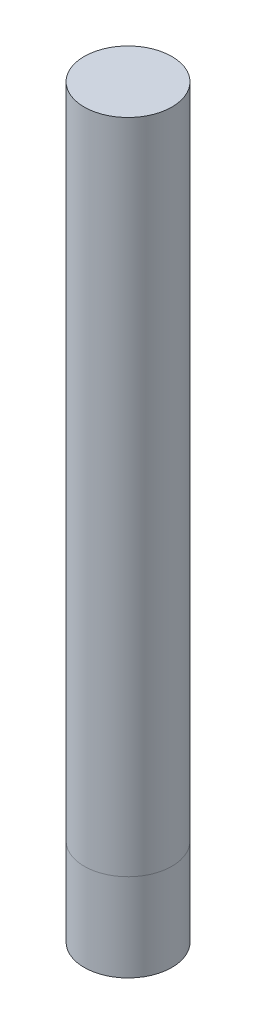
ISO-10303-21;
HEADER;
FILE_DESCRIPTION(('STEP AP214'),'2;1');
FILE_NAME('part.step','',(''),(''),'','','');
FILE_SCHEMA(('AUTOMOTIVE_DESIGN { 1 0 10303 214 1 1 1 1 }'));
ENDSEC;
DATA;
#1=APPLICATION_CONTEXT('core data for automotive mechanical design processes');
#2=APPLICATION_PROTOCOL_DEFINITION('international standard','automotive_design',2000,#1);
#3=PRODUCT_CONTEXT('',#1,'mechanical');
#4=PRODUCT('Part','Part','',(#3));
#5=PRODUCT_RELATED_PRODUCT_CATEGORY('part','',(#4));
#6=PRODUCT_DEFINITION_FORMATION('','',#4);
#7=PRODUCT_DEFINITION_CONTEXT('part definition',#1,'design');
#8=PRODUCT_DEFINITION('design','',#6,#7);
#9=PRODUCT_DEFINITION_SHAPE('','',#8);
#10=(LENGTH_UNIT() NAMED_UNIT(*) SI_UNIT(.MILLI.,.METRE.));
#11=(NAMED_UNIT(*) PLANE_ANGLE_UNIT() SI_UNIT($,.RADIAN.));
#12=(NAMED_UNIT(*) SI_UNIT($,.STERADIAN.) SOLID_ANGLE_UNIT());
#13=UNCERTAINTY_MEASURE_WITH_UNIT(LENGTH_MEASURE(1.E-05),#10,'distance_accuracy_value','');
#14=(GEOMETRIC_REPRESENTATION_CONTEXT(3) GLOBAL_UNCERTAINTY_ASSIGNED_CONTEXT((#13)) GLOBAL_UNIT_ASSIGNED_CONTEXT((#10,
#11,#12)) REPRESENTATION_CONTEXT('',''));
#15=CARTESIAN_POINT('',(0.,0.,0.));
#16=DIRECTION('',(0.,0.,1.));
#17=DIRECTION('',(1.,0.,0.));
#18=AXIS2_PLACEMENT_3D('',#15,#16,#17);
#19=CARTESIAN_POINT('',(0.,68.,0.));
#20=DIRECTION('',(0.,-1.,0.));
#21=DIRECTION('',(0.,0.,-1.));
#22=AXIS2_PLACEMENT_3D('',#19,#20,#21);
#23=CYLINDRICAL_SURFACE('',#22,4.);
#24=CARTESIAN_POINT('',(0.,68.,0.));
#25=DIRECTION('',(0.,1.,0.));
#26=DIRECTION('',(0.,0.,1.));
#27=AXIS2_PLACEMENT_3D('',#24,#25,#26);
#28=CIRCLE('',#27,4.);
#29=CARTESIAN_POINT('',(0.,68.,4.));
#30=VERTEX_POINT('',#29);
#31=EDGE_CURVE('E10',#30,#30,#28,.T.);
#32=ORIENTED_EDGE('',*,*,#31,.F.);
#33=EDGE_LOOP('',(#32));
#34=FACE_BOUND('',#33,.T.);
#35=CARTESIAN_POINT('',(0.,8.,0.));
#36=DIRECTION('',(0.,-1.,0.));
#37=DIRECTION('',(0.,0.,-1.));
#38=AXIS2_PLACEMENT_3D('',#35,#36,#37);
#39=CIRCLE('',#38,4.);
#40=CARTESIAN_POINT('',(0.,8.,-4.));
#41=VERTEX_POINT('',#40);
#42=EDGE_CURVE('E39',#41,#41,#39,.T.);
#43=ORIENTED_EDGE('',*,*,#42,.F.);
#44=EDGE_LOOP('',(#43));
#45=FACE_BOUND('',#44,.T.);
#46=ADVANCED_FACE('F33',(#34,#45),#23,.T.);
#47=CARTESIAN_POINT('',(0.,68.,0.));
#48=DIRECTION('',(0.,1.,0.));
#49=DIRECTION('',(0.,0.,1.));
#50=AXIS2_PLACEMENT_3D('',#47,#48,#49);
#51=PLANE('',#50);
#52=ORIENTED_EDGE('',*,*,#31,.T.);
#53=EDGE_LOOP('',(#52));
#54=FACE_BOUND('',#53,.T.);
#55=ADVANCED_FACE('F64',(#54),#51,.T.);
#56=CARTESIAN_POINT('',(0.,8.,0.));
#57=DIRECTION('',(0.,-1.,0.));
#58=DIRECTION('',(0.,0.,-1.));
#59=AXIS2_PLACEMENT_3D('',#56,#57,#58);
#60=PLANE('',#59);
#61=CARTESIAN_POINT('',(0.,8.,0.));
#62=DIRECTION('',(0.,-1.,0.));
#63=DIRECTION('',(0.,0.,-1.));
#64=AXIS2_PLACEMENT_3D('',#61,#62,#63);
#65=CIRCLE('',#64,3.999);
#66=CARTESIAN_POINT('',(0.,8.,-3.999));
#67=VERTEX_POINT('',#66);
#68=EDGE_CURVE('E43',#67,#67,#65,.T.);
#69=ORIENTED_EDGE('',*,*,#68,.F.);
#70=EDGE_LOOP('',(#69));
#71=FACE_BOUND('',#70,.T.);
#72=ORIENTED_EDGE('',*,*,#42,.T.);
#73=EDGE_LOOP('',(#72));
#74=FACE_BOUND('',#73,.T.);
#75=ADVANCED_FACE('F57',(#71,#74),#60,.T.);
#76=CARTESIAN_POINT('',(0.,8.,0.));
#77=DIRECTION('',(0.,-1.,0.));
#78=DIRECTION('',(0.,0.,-1.));
#79=AXIS2_PLACEMENT_3D('',#76,#77,#78);
#80=CYLINDRICAL_SURFACE('',#79,3.999);
#81=ORIENTED_EDGE('',*,*,#68,.T.);
#82=EDGE_LOOP('',(#81));
#83=FACE_BOUND('',#82,.T.);
#84=CARTESIAN_POINT('',(0.,0.,0.));
#85=DIRECTION('',(0.,-1.,0.));
#86=DIRECTION('',(0.,0.,-1.));
#87=AXIS2_PLACEMENT_3D('',#84,#85,#86);
#88=CIRCLE('',#87,3.999);
#89=CARTESIAN_POINT('',(0.,0.,-3.999));
#90=VERTEX_POINT('',#89);
#91=EDGE_CURVE('E47',#90,#90,#88,.T.);
#92=ORIENTED_EDGE('',*,*,#91,.F.);
#93=EDGE_LOOP('',(#92));
#94=FACE_BOUND('',#93,.T.);
#95=ADVANCED_FACE('F55',(#83,#94),#80,.T.);
#96=CARTESIAN_POINT('',(0.,0.,0.));
#97=DIRECTION('',(0.,1.,0.));
#98=DIRECTION('',(0.,0.,1.));
#99=AXIS2_PLACEMENT_3D('',#96,#97,#98);
#100=PLANE('',#99);
#101=ORIENTED_EDGE('',*,*,#91,.T.);
#102=EDGE_LOOP('',(#101));
#103=FACE_BOUND('',#102,.T.);
#104=ADVANCED_FACE('F53',(#103),#100,.F.);
#105=CLOSED_SHELL('',(#46,#55,#75,#95,#104));
#106=MANIFOLD_SOLID_BREP('B2',#105);
#107=ADVANCED_BREP_SHAPE_REPRESENTATION('',(#18,#106),#14);
#108=SHAPE_DEFINITION_REPRESENTATION(#9,#107);
ENDSEC;
END-ISO-10303-21;
